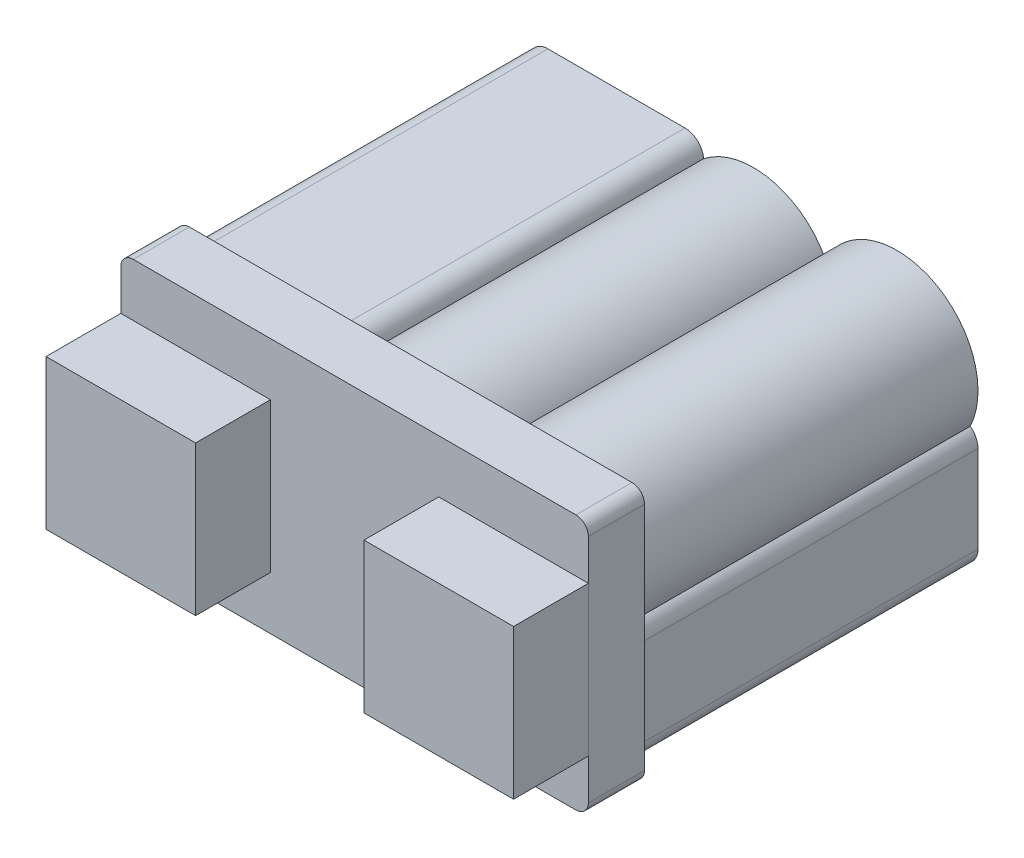
ISO-10303-21;
HEADER;
FILE_DESCRIPTION(('STEP AP214'),'2;1');
FILE_NAME('part.step','',(''),(''),'','','');
FILE_SCHEMA(('AUTOMOTIVE_DESIGN { 1 0 10303 214 1 1 1 1 }'));
ENDSEC;
DATA;
#1=APPLICATION_CONTEXT('core data for automotive mechanical design processes');
#2=APPLICATION_PROTOCOL_DEFINITION('international standard','automotive_design',2000,#1);
#3=PRODUCT_CONTEXT('',#1,'mechanical');
#4=PRODUCT('Part','Part','',(#3));
#5=PRODUCT_RELATED_PRODUCT_CATEGORY('part','',(#4));
#6=PRODUCT_DEFINITION_FORMATION('','',#4);
#7=PRODUCT_DEFINITION_CONTEXT('part definition',#1,'design');
#8=PRODUCT_DEFINITION('design','',#6,#7);
#9=PRODUCT_DEFINITION_SHAPE('','',#8);
#10=(LENGTH_UNIT() NAMED_UNIT(*) SI_UNIT(.MILLI.,.METRE.));
#11=(NAMED_UNIT(*) PLANE_ANGLE_UNIT() SI_UNIT($,.RADIAN.));
#12=(NAMED_UNIT(*) SI_UNIT($,.STERADIAN.) SOLID_ANGLE_UNIT());
#13=UNCERTAINTY_MEASURE_WITH_UNIT(LENGTH_MEASURE(1.E-05),#10,'distance_accuracy_value','');
#14=(GEOMETRIC_REPRESENTATION_CONTEXT(3) GLOBAL_UNCERTAINTY_ASSIGNED_CONTEXT((#13)) GLOBAL_UNIT_ASSIGNED_CONTEXT((#10,
#11,#12)) REPRESENTATION_CONTEXT('',''));
#15=CARTESIAN_POINT('',(0.,0.,0.));
#16=DIRECTION('',(0.,0.,1.));
#17=DIRECTION('',(1.,0.,0.));
#18=AXIS2_PLACEMENT_3D('',#15,#16,#17);
#19=CARTESIAN_POINT('',(-119.0625,38.1,241.3));
#20=DIRECTION('',(1.,0.,0.));
#21=DIRECTION('',(0.,0.,-1.));
#22=AXIS2_PLACEMENT_3D('',#19,#20,#21);
#23=PLANE('',#22);
#24=DIRECTION('',(0.,0.,1.));
#25=VECTOR('',#24,1.);
#26=CARTESIAN_POINT('',(-119.0625,-38.1,241.3));
#27=LINE('',#26,#25);
#28=CARTESIAN_POINT('',(-119.0625,-38.1,203.2));
#29=VERTEX_POINT('',#28);
#30=CARTESIAN_POINT('',(-119.0625,-38.1,241.3));
#31=VERTEX_POINT('',#30);
#32=EDGE_CURVE('E114',#29,#31,#27,.T.);
#33=ORIENTED_EDGE('',*,*,#32,.T.);
#34=DIRECTION('',(0.,-1.,0.));
#35=VECTOR('',#34,1.);
#36=CARTESIAN_POINT('',(-119.0625,38.1,241.3));
#37=LINE('',#36,#35);
#38=CARTESIAN_POINT('',(-119.0625,38.1,241.3));
#39=VERTEX_POINT('',#38);
#40=EDGE_CURVE('E12',#39,#31,#37,.T.);
#41=ORIENTED_EDGE('',*,*,#40,.F.);
#42=DIRECTION('',(0.,0.,1.));
#43=VECTOR('',#42,1.);
#44=CARTESIAN_POINT('',(-119.0625,38.1,241.3));
#45=LINE('',#44,#43);
#46=CARTESIAN_POINT('',(-119.0625,38.1,203.2));
#47=VERTEX_POINT('',#46);
#48=EDGE_CURVE('E99',#47,#39,#45,.T.);
#49=ORIENTED_EDGE('',*,*,#48,.F.);
#50=DIRECTION('',(0.,-1.,0.));
#51=VECTOR('',#50,1.);
#52=CARTESIAN_POINT('',(-119.0625,38.1,203.2));
#53=LINE('',#52,#51);
#54=EDGE_CURVE('E101',#47,#29,#53,.T.);
#55=ORIENTED_EDGE('',*,*,#54,.T.);
#56=EDGE_LOOP('',(#33,#41,#49,#55));
#57=FACE_BOUND('',#56,.T.);
#58=ADVANCED_FACE('F48',(#57),#23,.F.);
#59=CARTESIAN_POINT('',(-119.0625,38.1,241.3));
#60=DIRECTION('',(0.,0.,-1.));
#61=DIRECTION('',(-1.,0.,0.));
#62=AXIS2_PLACEMENT_3D('',#59,#60,#61);
#63=PLANE('',#62);
#64=DIRECTION('',(1.,0.,0.));
#65=VECTOR('',#64,1.);
#66=CARTESIAN_POINT('',(-119.0625,-38.1,241.3));
#67=LINE('',#66,#65);
#68=CARTESIAN_POINT('',(-42.8624999999998,-38.1,241.3));
#69=VERTEX_POINT('',#68);
#70=EDGE_CURVE('E104',#31,#69,#67,.T.);
#71=ORIENTED_EDGE('',*,*,#70,.T.);
#72=DIRECTION('',(0.,-1.,0.));
#73=VECTOR('',#72,1.);
#74=CARTESIAN_POINT('',(-42.8624999999998,38.1,241.3));
#75=LINE('',#74,#73);
#76=CARTESIAN_POINT('',(-42.8624999999998,38.1,241.3));
#77=VERTEX_POINT('',#76);
#78=EDGE_CURVE('E56',#77,#69,#75,.T.);
#79=ORIENTED_EDGE('',*,*,#78,.F.);
#80=DIRECTION('',(1.,0.,0.));
#81=VECTOR('',#80,1.);
#82=CARTESIAN_POINT('',(-119.0625,38.1,241.3));
#83=LINE('',#82,#81);
#84=EDGE_CURVE('E94',#39,#77,#83,.T.);
#85=ORIENTED_EDGE('',*,*,#84,.F.);
#86=ORIENTED_EDGE('',*,*,#40,.T.);
#87=EDGE_LOOP('',(#71,#79,#85,#86));
#88=FACE_BOUND('',#87,.T.);
#89=ADVANCED_FACE('F103',(#88),#63,.F.);
#90=CARTESIAN_POINT('',(-42.8624999999998,38.1,241.3));
#91=DIRECTION('',(-1.,0.,0.));
#92=DIRECTION('',(0.,0.,1.));
#93=AXIS2_PLACEMENT_3D('',#90,#91,#92);
#94=PLANE('',#93);
#95=DIRECTION('',(0.,0.,-1.));
#96=VECTOR('',#95,1.);
#97=CARTESIAN_POINT('',(-42.8624999999998,-38.1,241.3));
#98=LINE('',#97,#96);
#99=CARTESIAN_POINT('',(-42.8624999999999,-38.1,203.2));
#100=VERTEX_POINT('',#99);
#101=EDGE_CURVE('E81',#69,#100,#98,.T.);
#102=ORIENTED_EDGE('',*,*,#101,.T.);
#103=DIRECTION('',(0.,-1.,0.));
#104=VECTOR('',#103,1.);
#105=CARTESIAN_POINT('',(-42.8624999999999,38.1,203.2));
#106=LINE('',#105,#104);
#107=CARTESIAN_POINT('',(-42.8624999999999,38.1,203.2));
#108=VERTEX_POINT('',#107);
#109=EDGE_CURVE('E105',#108,#100,#106,.T.);
#110=ORIENTED_EDGE('',*,*,#109,.F.);
#111=DIRECTION('',(0.,0.,-1.));
#112=VECTOR('',#111,1.);
#113=CARTESIAN_POINT('',(-42.8624999999998,38.1,241.3));
#114=LINE('',#113,#112);
#115=EDGE_CURVE('E97',#77,#108,#114,.T.);
#116=ORIENTED_EDGE('',*,*,#115,.F.);
#117=ORIENTED_EDGE('',*,*,#78,.T.);
#118=EDGE_LOOP('',(#102,#110,#116,#117));
#119=FACE_BOUND('',#118,.T.);
#120=ADVANCED_FACE('F106',(#119),#94,.F.);
#121=CARTESIAN_POINT('',(-119.0625,38.1,203.2));
#122=DIRECTION('',(0.,0.,1.));
#123=DIRECTION('',(1.,0.,0.));
#124=AXIS2_PLACEMENT_3D('',#121,#122,#123);
#125=PLANE('',#124);
#126=DIRECTION('',(-1.,0.,0.));
#127=VECTOR('',#126,1.);
#128=CARTESIAN_POINT('',(-119.0625,-38.1,203.2));
#129=LINE('',#128,#127);
#130=EDGE_CURVE('E87',#100,#29,#129,.T.);
#131=ORIENTED_EDGE('',*,*,#130,.T.);
#132=ORIENTED_EDGE('',*,*,#54,.F.);
#133=DIRECTION('',(-1.,0.,0.));
#134=VECTOR('',#133,1.);
#135=CARTESIAN_POINT('',(-119.0625,38.1,203.2));
#136=LINE('',#135,#134);
#137=EDGE_CURVE('E64',#108,#47,#136,.T.);
#138=ORIENTED_EDGE('',*,*,#137,.F.);
#139=ORIENTED_EDGE('',*,*,#109,.T.);
#140=EDGE_LOOP('',(#131,#132,#138,#139));
#141=FACE_BOUND('',#140,.T.);
#142=ADVANCED_FACE('F118',(#141),#125,.F.);
#143=CARTESIAN_POINT('',(-119.0625,38.1,203.2));
#144=DIRECTION('',(0.,-1.,0.));
#145=DIRECTION('',(0.,0.,-1.));
#146=AXIS2_PLACEMENT_3D('',#143,#144,#145);
#147=PLANE('',#146);
#148=ORIENTED_EDGE('',*,*,#48,.T.);
#149=ORIENTED_EDGE('',*,*,#84,.T.);
#150=ORIENTED_EDGE('',*,*,#115,.T.);
#151=ORIENTED_EDGE('',*,*,#137,.T.);
#152=EDGE_LOOP('',(#148,#149,#150,#151));
#153=FACE_BOUND('',#152,.T.);
#154=ADVANCED_FACE('F95',(#153),#147,.F.);
#155=CARTESIAN_POINT('',(-119.0625,-38.1,203.2));
#156=DIRECTION('',(0.,-1.,0.));
#157=DIRECTION('',(0.,0.,-1.));
#158=AXIS2_PLACEMENT_3D('',#155,#156,#157);
#159=PLANE('',#158);
#160=ORIENTED_EDGE('',*,*,#32,.F.);
#161=ORIENTED_EDGE('',*,*,#130,.F.);
#162=ORIENTED_EDGE('',*,*,#101,.F.);
#163=ORIENTED_EDGE('',*,*,#70,.F.);
#164=EDGE_LOOP('',(#160,#161,#162,#163));
#165=FACE_BOUND('',#164,.T.);
#166=ADVANCED_FACE('F121',(#165),#159,.T.);
#167=CLOSED_SHELL('',(#58,#89,#120,#142,#154,#166));
#168=MANIFOLD_SOLID_BREP('B2',#167);
#169=CARTESIAN_POINT('',(119.0625,38.1,241.3));
#170=DIRECTION('',(-1.,0.,0.));
#171=DIRECTION('',(0.,0.,1.));
#172=AXIS2_PLACEMENT_3D('',#169,#170,#171);
#173=PLANE('',#172);
#174=DIRECTION('',(0.,0.,-1.));
#175=VECTOR('',#174,1.);
#176=CARTESIAN_POINT('',(119.0625,-38.1,241.3));
#177=LINE('',#176,#175);
#178=CARTESIAN_POINT('',(119.0625,-38.1,241.3));
#179=VERTEX_POINT('',#178);
#180=CARTESIAN_POINT('',(119.0625,-38.1,203.2));
#181=VERTEX_POINT('',#180);
#182=EDGE_CURVE('E246',#179,#181,#177,.T.);
#183=ORIENTED_EDGE('',*,*,#182,.T.);
#184=DIRECTION('',(0.,-1.,0.));
#185=VECTOR('',#184,1.);
#186=CARTESIAN_POINT('',(119.0625,38.1,203.2));
#187=LINE('',#186,#185);
#188=CARTESIAN_POINT('',(119.0625,38.1,203.2));
#189=VERTEX_POINT('',#188);
#190=EDGE_CURVE('E46',#189,#181,#187,.T.);
#191=ORIENTED_EDGE('',*,*,#190,.F.);
#192=DIRECTION('',(0.,0.,-1.));
#193=VECTOR('',#192,1.);
#194=CARTESIAN_POINT('',(119.0625,38.1,241.3));
#195=LINE('',#194,#193);
#196=CARTESIAN_POINT('',(119.0625,38.1,241.3));
#197=VERTEX_POINT('',#196);
#198=EDGE_CURVE('E242',#197,#189,#195,.T.);
#199=ORIENTED_EDGE('',*,*,#198,.F.);
#200=DIRECTION('',(0.,-1.,0.));
#201=VECTOR('',#200,1.);
#202=CARTESIAN_POINT('',(119.0625,38.1,241.3));
#203=LINE('',#202,#201);
#204=EDGE_CURVE('E184',#197,#179,#203,.T.);
#205=ORIENTED_EDGE('',*,*,#204,.T.);
#206=EDGE_LOOP('',(#183,#191,#199,#205));
#207=FACE_BOUND('',#206,.T.);
#208=ADVANCED_FACE('F181',(#207),#173,.F.);
#209=CARTESIAN_POINT('',(119.0625,38.1,203.2));
#210=DIRECTION('',(0.,0.,1.));
#211=DIRECTION('',(1.,0.,0.));
#212=AXIS2_PLACEMENT_3D('',#209,#210,#211);
#213=PLANE('',#212);
#214=DIRECTION('',(-1.,0.,0.));
#215=VECTOR('',#214,1.);
#216=CARTESIAN_POINT('',(119.0625,-38.1,203.2));
#217=LINE('',#216,#215);
#218=CARTESIAN_POINT('',(42.8625,-38.1,203.2));
#219=VERTEX_POINT('',#218);
#220=EDGE_CURVE('E212',#181,#219,#217,.T.);
#221=ORIENTED_EDGE('',*,*,#220,.T.);
#222=DIRECTION('',(0.,-1.,0.));
#223=VECTOR('',#222,1.);
#224=CARTESIAN_POINT('',(42.8625,38.1,203.2));
#225=LINE('',#224,#223);
#226=CARTESIAN_POINT('',(42.8625,38.1,203.2));
#227=VERTEX_POINT('',#226);
#228=EDGE_CURVE('E190',#227,#219,#225,.T.);
#229=ORIENTED_EDGE('',*,*,#228,.F.);
#230=DIRECTION('',(-1.,0.,0.));
#231=VECTOR('',#230,1.);
#232=CARTESIAN_POINT('',(119.0625,38.1,203.2));
#233=LINE('',#232,#231);
#234=EDGE_CURVE('E198',#189,#227,#233,.T.);
#235=ORIENTED_EDGE('',*,*,#234,.F.);
#236=ORIENTED_EDGE('',*,*,#190,.T.);
#237=EDGE_LOOP('',(#221,#229,#235,#236));
#238=FACE_BOUND('',#237,.T.);
#239=ADVANCED_FACE('F255',(#238),#213,.F.);
#240=CARTESIAN_POINT('',(42.8625,38.1,241.3));
#241=DIRECTION('',(1.,0.,0.));
#242=DIRECTION('',(0.,0.,-1.));
#243=AXIS2_PLACEMENT_3D('',#240,#241,#242);
#244=PLANE('',#243);
#245=DIRECTION('',(0.,0.,1.));
#246=VECTOR('',#245,1.);
#247=CARTESIAN_POINT('',(42.8625,-38.1,241.3));
#248=LINE('',#247,#246);
#249=CARTESIAN_POINT('',(42.8625,-38.1,241.3));
#250=VERTEX_POINT('',#249);
#251=EDGE_CURVE('E234',#219,#250,#248,.T.);
#252=ORIENTED_EDGE('',*,*,#251,.T.);
#253=DIRECTION('',(0.,-1.,0.));
#254=VECTOR('',#253,1.);
#255=CARTESIAN_POINT('',(42.8625,38.1,241.3));
#256=LINE('',#255,#254);
#257=CARTESIAN_POINT('',(42.8625,38.1,241.3));
#258=VERTEX_POINT('',#257);
#259=EDGE_CURVE('E232',#258,#250,#256,.T.);
#260=ORIENTED_EDGE('',*,*,#259,.F.);
#261=DIRECTION('',(0.,0.,1.));
#262=VECTOR('',#261,1.);
#263=CARTESIAN_POINT('',(42.8625,38.1,241.3));
#264=LINE('',#263,#262);
#265=EDGE_CURVE('E226',#227,#258,#264,.T.);
#266=ORIENTED_EDGE('',*,*,#265,.F.);
#267=ORIENTED_EDGE('',*,*,#228,.T.);
#268=EDGE_LOOP('',(#252,#260,#266,#267));
#269=FACE_BOUND('',#268,.T.);
#270=ADVANCED_FACE('F233',(#269),#244,.F.);
#271=CARTESIAN_POINT('',(119.0625,38.1,241.3));
#272=DIRECTION('',(0.,0.,-1.));
#273=DIRECTION('',(-1.,0.,0.));
#274=AXIS2_PLACEMENT_3D('',#271,#272,#273);
#275=PLANE('',#274);
#276=DIRECTION('',(1.,0.,0.));
#277=VECTOR('',#276,1.);
#278=CARTESIAN_POINT('',(119.0625,-38.1,241.3));
#279=LINE('',#278,#277);
#280=EDGE_CURVE('E249',#250,#179,#279,.T.);
#281=ORIENTED_EDGE('',*,*,#280,.T.);
#282=ORIENTED_EDGE('',*,*,#204,.F.);
#283=DIRECTION('',(1.,0.,0.));
#284=VECTOR('',#283,1.);
#285=CARTESIAN_POINT('',(119.0625,38.1,241.3));
#286=LINE('',#285,#284);
#287=EDGE_CURVE('E223',#258,#197,#286,.T.);
#288=ORIENTED_EDGE('',*,*,#287,.F.);
#289=ORIENTED_EDGE('',*,*,#259,.T.);
#290=EDGE_LOOP('',(#281,#282,#288,#289));
#291=FACE_BOUND('',#290,.T.);
#292=ADVANCED_FACE('F237',(#291),#275,.F.);
#293=CARTESIAN_POINT('',(119.0625,38.1,203.2));
#294=DIRECTION('',(0.,1.,0.));
#295=DIRECTION('',(0.,0.,1.));
#296=AXIS2_PLACEMENT_3D('',#293,#294,#295);
#297=PLANE('',#296);
#298=ORIENTED_EDGE('',*,*,#198,.T.);
#299=ORIENTED_EDGE('',*,*,#234,.T.);
#300=ORIENTED_EDGE('',*,*,#265,.T.);
#301=ORIENTED_EDGE('',*,*,#287,.T.);
#302=EDGE_LOOP('',(#298,#299,#300,#301));
#303=FACE_BOUND('',#302,.T.);
#304=ADVANCED_FACE('F228',(#303),#297,.T.);
#305=CARTESIAN_POINT('',(119.0625,-38.1,203.2));
#306=DIRECTION('',(0.,1.,0.));
#307=DIRECTION('',(0.,0.,1.));
#308=AXIS2_PLACEMENT_3D('',#305,#306,#307);
#309=PLANE('',#308);
#310=ORIENTED_EDGE('',*,*,#182,.F.);
#311=ORIENTED_EDGE('',*,*,#280,.F.);
#312=ORIENTED_EDGE('',*,*,#251,.F.);
#313=ORIENTED_EDGE('',*,*,#220,.F.);
#314=EDGE_LOOP('',(#310,#311,#312,#313));
#315=FACE_BOUND('',#314,.T.);
#316=ADVANCED_FACE('F252',(#315),#309,.F.);
#317=CLOSED_SHELL('',(#208,#239,#270,#292,#304,#316));
#318=MANIFOLD_SOLID_BREP('B6',#317);
#319=CARTESIAN_POINT('',(119.0625,-65.0875,203.2));
#320=DIRECTION('',(-1.,0.,0.));
#321=DIRECTION('',(0.,0.,1.));
#322=AXIS2_PLACEMENT_3D('',#319,#320,#321);
#323=PLANE('',#322);
#324=DIRECTION('',(0.,1.,0.));
#325=VECTOR('',#324,1.);
#326=CARTESIAN_POINT('',(119.0625,-65.0875,203.2));
#327=LINE('',#326,#325);
#328=CARTESIAN_POINT('',(119.0625,-58.7375,203.2));
#329=VERTEX_POINT('',#328);
#330=CARTESIAN_POINT('',(119.0625,58.7375,203.2));
#331=VERTEX_POINT('',#330);
#332=EDGE_CURVE('E561',#329,#331,#327,.T.);
#333=ORIENTED_EDGE('',*,*,#332,.F.);
#334=DIRECTION('',(0.,0.,-1.));
#335=VECTOR('',#334,1.);
#336=CARTESIAN_POINT('',(119.0625,-58.7375,203.2));
#337=LINE('',#336,#335);
#338=CARTESIAN_POINT('',(119.0625,-58.7375,174.625));
#339=VERTEX_POINT('',#338);
#340=EDGE_CURVE('E179',#329,#339,#337,.T.);
#341=ORIENTED_EDGE('',*,*,#340,.T.);
#342=DIRECTION('',(0.,-1.,0.));
#343=VECTOR('',#342,1.);
#344=CARTESIAN_POINT('',(119.0625,0.,174.625));
#345=LINE('',#344,#343);
#346=CARTESIAN_POINT('',(119.0625,58.7375,174.625));
#347=VERTEX_POINT('',#346);
#348=EDGE_CURVE('E513',#347,#339,#345,.T.);
#349=ORIENTED_EDGE('',*,*,#348,.F.);
#350=DIRECTION('',(0.,0.,-1.));
#351=VECTOR('',#350,1.);
#352=CARTESIAN_POINT('',(119.0625,58.7375,203.2));
#353=LINE('',#352,#351);
#354=EDGE_CURVE('E312',#347,#331,#353,.F.);
#355=ORIENTED_EDGE('',*,*,#354,.T.);
#356=EDGE_LOOP('',(#333,#341,#349,#355));
#357=FACE_BOUND('',#356,.T.);
#358=ADVANCED_FACE('F304',(#357),#323,.F.);
#359=CARTESIAN_POINT('',(-119.0625,65.0875,203.2));
#360=DIRECTION('',(0.,-1.,0.));
#361=DIRECTION('',(0.,0.,-1.));
#362=AXIS2_PLACEMENT_3D('',#359,#360,#361);
#363=PLANE('',#362);
#364=DIRECTION('',(1.,0.,0.));
#365=VECTOR('',#364,1.);
#366=CARTESIAN_POINT('',(-211.228306266812,65.0875,174.625));
#367=LINE('',#366,#365);
#368=CARTESIAN_POINT('',(-112.7125,65.0875,174.625));
#369=VERTEX_POINT('',#368);
#370=CARTESIAN_POINT('',(112.7125,65.0875,174.625));
#371=VERTEX_POINT('',#370);
#372=EDGE_CURVE('E510',#369,#371,#367,.T.);
#373=ORIENTED_EDGE('',*,*,#372,.F.);
#374=DIRECTION('',(0.,0.,-1.));
#375=VECTOR('',#374,1.);
#376=CARTESIAN_POINT('',(-112.7125,65.0875,203.2));
#377=LINE('',#376,#375);
#378=CARTESIAN_POINT('',(-112.7125,65.0875,203.2));
#379=VERTEX_POINT('',#378);
#380=EDGE_CURVE('E319',#369,#379,#377,.F.);
#381=ORIENTED_EDGE('',*,*,#380,.T.);
#382=DIRECTION('',(-1.,0.,0.));
#383=VECTOR('',#382,1.);
#384=CARTESIAN_POINT('',(-119.0625,65.0875,203.2));
#385=LINE('',#384,#383);
#386=CARTESIAN_POINT('',(112.7125,65.0875,203.2));
#387=VERTEX_POINT('',#386);
#388=EDGE_CURVE('E586',#387,#379,#385,.T.);
#389=ORIENTED_EDGE('',*,*,#388,.F.);
#390=DIRECTION('',(0.,0.,-1.));
#391=VECTOR('',#390,1.);
#392=CARTESIAN_POINT('',(112.7125,65.0875,203.2));
#393=LINE('',#392,#391);
#394=EDGE_CURVE('E619',#387,#371,#393,.T.);
#395=ORIENTED_EDGE('',*,*,#394,.T.);
#396=EDGE_LOOP('',(#373,#381,#389,#395));
#397=FACE_BOUND('',#396,.T.);
#398=ADVANCED_FACE('F631',(#397),#363,.F.);
#399=CARTESIAN_POINT('',(-119.0625,-65.0875,203.2));
#400=DIRECTION('',(1.,0.,0.));
#401=DIRECTION('',(0.,0.,-1.));
#402=AXIS2_PLACEMENT_3D('',#399,#400,#401);
#403=PLANE('',#402);
#404=DIRECTION('',(0.,1.,0.));
#405=VECTOR('',#404,1.);
#406=CARTESIAN_POINT('',(-119.0625,0.,174.625));
#407=LINE('',#406,#405);
#408=CARTESIAN_POINT('',(-119.0625,-58.7375,174.625));
#409=VERTEX_POINT('',#408);
#410=CARTESIAN_POINT('',(-119.0625,58.7375,174.625));
#411=VERTEX_POINT('',#410);
#412=EDGE_CURVE('E466',#409,#411,#407,.T.);
#413=ORIENTED_EDGE('',*,*,#412,.F.);
#414=DIRECTION('',(0.,0.,-1.));
#415=VECTOR('',#414,1.);
#416=CARTESIAN_POINT('',(-119.0625,-58.7375,203.2));
#417=LINE('',#416,#415);
#418=CARTESIAN_POINT('',(-119.0625,-58.7375,203.2));
#419=VERTEX_POINT('',#418);
#420=EDGE_CURVE('E610',#409,#419,#417,.F.);
#421=ORIENTED_EDGE('',*,*,#420,.T.);
#422=DIRECTION('',(0.,-1.,0.));
#423=VECTOR('',#422,1.);
#424=CARTESIAN_POINT('',(-119.0625,-65.0875,203.2));
#425=LINE('',#424,#423);
#426=CARTESIAN_POINT('',(-119.0625,58.7375,203.2));
#427=VERTEX_POINT('',#426);
#428=EDGE_CURVE('E588',#427,#419,#425,.T.);
#429=ORIENTED_EDGE('',*,*,#428,.F.);
#430=DIRECTION('',(0.,0.,-1.));
#431=VECTOR('',#430,1.);
#432=CARTESIAN_POINT('',(-119.0625,58.7375,203.2));
#433=LINE('',#432,#431);
#434=EDGE_CURVE('E607',#427,#411,#433,.T.);
#435=ORIENTED_EDGE('',*,*,#434,.T.);
#436=EDGE_LOOP('',(#413,#421,#429,#435));
#437=FACE_BOUND('',#436,.T.);
#438=ADVANCED_FACE('F639',(#437),#403,.F.);
#439=CARTESIAN_POINT('',(-119.0625,-65.0875,203.2));
#440=DIRECTION('',(0.,1.,0.));
#441=DIRECTION('',(0.,0.,1.));
#442=AXIS2_PLACEMENT_3D('',#439,#440,#441);
#443=PLANE('',#442);
#444=DIRECTION('',(1.,0.,0.));
#445=VECTOR('',#444,1.);
#446=CARTESIAN_POINT('',(-119.0625,-65.0875,203.2));
#447=LINE('',#446,#445);
#448=CARTESIAN_POINT('',(-112.7125,-65.0875,203.2));
#449=VERTEX_POINT('',#448);
#450=CARTESIAN_POINT('',(112.7125,-65.0875,203.2));
#451=VERTEX_POINT('',#450);
#452=EDGE_CURVE('E591',#449,#451,#447,.T.);
#453=ORIENTED_EDGE('',*,*,#452,.F.);
#454=DIRECTION('',(0.,0.,-1.));
#455=VECTOR('',#454,1.);
#456=CARTESIAN_POINT('',(-112.7125,-65.0875,203.2));
#457=LINE('',#456,#455);
#458=CARTESIAN_POINT('',(-112.7125,-65.0875,174.625));
#459=VERTEX_POINT('',#458);
#460=EDGE_CURVE('E596',#449,#459,#457,.T.);
#461=ORIENTED_EDGE('',*,*,#460,.T.);
#462=DIRECTION('',(-1.,0.,0.));
#463=VECTOR('',#462,1.);
#464=CARTESIAN_POINT('',(-211.228306266812,-65.0875,174.625));
#465=LINE('',#464,#463);
#466=CARTESIAN_POINT('',(112.7125,-65.0875,174.625));
#467=VERTEX_POINT('',#466);
#468=EDGE_CURVE('E516',#467,#459,#465,.T.);
#469=ORIENTED_EDGE('',*,*,#468,.F.);
#470=DIRECTION('',(0.,0.,-1.));
#471=VECTOR('',#470,1.);
#472=CARTESIAN_POINT('',(112.7125,-65.0875,203.2));
#473=LINE('',#472,#471);
#474=EDGE_CURVE('E594',#467,#451,#473,.F.);
#475=ORIENTED_EDGE('',*,*,#474,.T.);
#476=EDGE_LOOP('',(#453,#461,#469,#475));
#477=FACE_BOUND('',#476,.T.);
#478=ADVANCED_FACE('F648',(#477),#443,.F.);
#479=CARTESIAN_POINT('',(119.0625,65.0875,203.2));
#480=DIRECTION('',(0.,0.,-1.));
#481=DIRECTION('',(-1.,0.,0.));
#482=AXIS2_PLACEMENT_3D('',#479,#480,#481);
#483=PLANE('',#482);
#484=ORIENTED_EDGE('',*,*,#428,.T.);
#485=CARTESIAN_POINT('',(-112.7125,-58.7375,203.2));
#486=DIRECTION('',(0.,0.,-1.));
#487=DIRECTION('',(-1.,0.,0.));
#488=AXIS2_PLACEMENT_3D('',#485,#486,#487);
#489=CIRCLE('',#488,6.35);
#490=EDGE_CURVE('E617',#419,#449,#489,.F.);
#491=ORIENTED_EDGE('',*,*,#490,.T.);
#492=ORIENTED_EDGE('',*,*,#452,.T.);
#493=CARTESIAN_POINT('',(112.7125,-58.7375,203.2));
#494=DIRECTION('',(0.,0.,-1.));
#495=DIRECTION('',(-1.,0.,0.));
#496=AXIS2_PLACEMENT_3D('',#493,#494,#495);
#497=CIRCLE('',#496,6.35);
#498=EDGE_CURVE('E613',#451,#329,#497,.F.);
#499=ORIENTED_EDGE('',*,*,#498,.T.);
#500=ORIENTED_EDGE('',*,*,#332,.T.);
#501=CARTESIAN_POINT('',(112.7125,58.7375,203.2));
#502=DIRECTION('',(0.,0.,-1.));
#503=DIRECTION('',(-1.,0.,0.));
#504=AXIS2_PLACEMENT_3D('',#501,#502,#503);
#505=CIRCLE('',#504,6.35);
#506=EDGE_CURVE('E326',#331,#387,#505,.F.);
#507=ORIENTED_EDGE('',*,*,#506,.T.);
#508=ORIENTED_EDGE('',*,*,#388,.T.);
#509=CARTESIAN_POINT('',(-112.7125,58.7375,203.2));
#510=DIRECTION('',(0.,0.,-1.));
#511=DIRECTION('',(-1.,0.,0.));
#512=AXIS2_PLACEMENT_3D('',#509,#510,#511);
#513=CIRCLE('',#512,6.35);
#514=EDGE_CURVE('E615',#379,#427,#513,.F.);
#515=ORIENTED_EDGE('',*,*,#514,.T.);
#516=EDGE_LOOP('',(#484,#491,#492,#499,#500,#507,#508,#515));
#517=FACE_BOUND('',#516,.T.);
#518=ADVANCED_FACE('F628',(#517),#483,.F.);
#519=CARTESIAN_POINT('',(104.775,-50.8,174.625));
#520=DIRECTION('',(0.,0.,-1.));
#521=DIRECTION('',(-1.,0.,0.));
#522=AXIS2_PLACEMENT_3D('',#519,#520,#521);
#523=CYLINDRICAL_SURFACE('',#522,9.52499999999999);
#524=CARTESIAN_POINT('',(104.775,-50.8,0.));
#525=DIRECTION('',(0.,0.,-1.));
#526=DIRECTION('',(-1.,0.,0.));
#527=AXIS2_PLACEMENT_3D('',#524,#525,#526);
#528=CIRCLE('',#527,9.52499999999999);
#529=CARTESIAN_POINT('',(114.3,-50.8,0.));
#530=VERTEX_POINT('',#529);
#531=CARTESIAN_POINT('',(104.775,-60.325,0.));
#532=VERTEX_POINT('',#531);
#533=EDGE_CURVE('E460',#530,#532,#528,.T.);
#534=ORIENTED_EDGE('',*,*,#533,.F.);
#535=DIRECTION('',(0.,0.,-1.));
#536=VECTOR('',#535,1.);
#537=CARTESIAN_POINT('',(114.3,-50.8,174.625));
#538=LINE('',#537,#536);
#539=CARTESIAN_POINT('',(114.3,-50.8,174.625));
#540=VERTEX_POINT('',#539);
#541=EDGE_CURVE('E454',#540,#530,#538,.T.);
#542=ORIENTED_EDGE('',*,*,#541,.F.);
#543=CARTESIAN_POINT('',(104.775,-50.8,174.625));
#544=DIRECTION('',(0.,0.,-1.));
#545=DIRECTION('',(-1.,0.,0.));
#546=AXIS2_PLACEMENT_3D('',#543,#544,#545);
#547=CIRCLE('',#546,9.52499999999999);
#548=CARTESIAN_POINT('',(104.775,-60.325,174.625));
#549=VERTEX_POINT('',#548);
#550=EDGE_CURVE('E457',#540,#549,#547,.T.);
#551=ORIENTED_EDGE('',*,*,#550,.T.);
#552=DIRECTION('',(0.,0.,-1.));
#553=VECTOR('',#552,1.);
#554=CARTESIAN_POINT('',(104.775,-60.325,174.625));
#555=LINE('',#554,#553);
#556=EDGE_CURVE('E559',#549,#532,#555,.T.);
#557=ORIENTED_EDGE('',*,*,#556,.T.);
#558=EDGE_LOOP('',(#534,#542,#551,#557));
#559=FACE_BOUND('',#558,.T.);
#560=ADVANCED_FACE('F456',(#559),#523,.T.);
#561=CARTESIAN_POINT('',(-211.228306266812,-60.325,174.625));
#562=DIRECTION('',(0.,1.,0.));
#563=DIRECTION('',(0.,0.,1.));
#564=AXIS2_PLACEMENT_3D('',#561,#562,#563);
#565=PLANE('',#564);
#566=DIRECTION('',(1.,0.,0.));
#567=VECTOR('',#566,1.);
#568=CARTESIAN_POINT('',(-211.228306266812,-60.325,0.));
#569=LINE('',#568,#567);
#570=CARTESIAN_POINT('',(34.925,-60.325,0.));
#571=VERTEX_POINT('',#570);
#572=EDGE_CURVE('E478',#571,#532,#569,.T.);
#573=ORIENTED_EDGE('',*,*,#572,.T.);
#574=ORIENTED_EDGE('',*,*,#556,.F.);
#575=DIRECTION('',(1.,0.,0.));
#576=VECTOR('',#575,1.);
#577=CARTESIAN_POINT('',(-211.228306266812,-60.325,174.625));
#578=LINE('',#577,#576);
#579=CARTESIAN_POINT('',(34.925,-60.325,174.625));
#580=VERTEX_POINT('',#579);
#581=EDGE_CURVE('E477',#580,#549,#578,.T.);
#582=ORIENTED_EDGE('',*,*,#581,.F.);
#583=DIRECTION('',(0.,0.,-1.));
#584=VECTOR('',#583,1.);
#585=CARTESIAN_POINT('',(34.925,-60.325,174.625));
#586=LINE('',#585,#584);
#587=EDGE_CURVE('E562',#580,#571,#586,.T.);
#588=ORIENTED_EDGE('',*,*,#587,.T.);
#589=EDGE_LOOP('',(#573,#574,#582,#588));
#590=FACE_BOUND('',#589,.T.);
#591=ADVANCED_FACE('F702',(#590),#565,.F.);
#592=CARTESIAN_POINT('',(34.925,-50.8,174.625));
#593=DIRECTION('',(0.,0.,-1.));
#594=DIRECTION('',(-1.,0.,0.));
#595=AXIS2_PLACEMENT_3D('',#592,#593,#594);
#596=CYLINDRICAL_SURFACE('',#595,9.525);
#597=CARTESIAN_POINT('',(34.925,-50.8,0.));
#598=DIRECTION('',(0.,0.,-1.));
#599=DIRECTION('',(-1.,0.,0.));
#600=AXIS2_PLACEMENT_3D('',#597,#598,#599);
#601=CIRCLE('',#600,9.525);
#602=CARTESIAN_POINT('',(25.4303939722906,-51.5603166304803,0.));
#603=VERTEX_POINT('',#602);
#604=EDGE_CURVE('E554',#603,#571,#601,.F.);
#605=ORIENTED_EDGE('',*,*,#604,.T.);
#606=ORIENTED_EDGE('',*,*,#587,.F.);
#607=CARTESIAN_POINT('',(34.925,-50.8,174.625));
#608=DIRECTION('',(0.,0.,-1.));
#609=DIRECTION('',(-1.,0.,0.));
#610=AXIS2_PLACEMENT_3D('',#607,#608,#609);
#611=CIRCLE('',#610,9.525);
#612=CARTESIAN_POINT('',(25.4303939722906,-51.5603166304803,174.625));
#613=VERTEX_POINT('',#612);
#614=EDGE_CURVE('E507',#613,#580,#611,.F.);
#615=ORIENTED_EDGE('',*,*,#614,.F.);
#616=DIRECTION('',(0.,0.,-1.));
#617=VECTOR('',#616,1.);
#618=CARTESIAN_POINT('',(25.4303939722906,-51.5603166304803,174.625));
#619=LINE('',#618,#617);
#620=EDGE_CURVE('E564',#613,#603,#619,.T.);
#621=ORIENTED_EDGE('',*,*,#620,.T.);
#622=EDGE_LOOP('',(#605,#606,#615,#621));
#623=FACE_BOUND('',#622,.T.);
#624=ADVANCED_FACE('F708',(#623),#596,.T.);
#625=CARTESIAN_POINT('',(0.,-19.05,174.625));
#626=DIRECTION('',(0.,0.,-1.));
#627=DIRECTION('',(-1.,0.,0.));
#628=AXIS2_PLACEMENT_3D('',#625,#626,#627);
#629=CYLINDRICAL_SURFACE('',#628,41.275);
#630=CARTESIAN_POINT('',(0.,-19.05,0.));
#631=DIRECTION('',(0.,0.,-1.));
#632=DIRECTION('',(-1.,0.,0.));
#633=AXIS2_PLACEMENT_3D('',#630,#631,#632);
#634=CIRCLE('',#633,41.275);
#635=CARTESIAN_POINT('',(-36.5125,-38.2974145991091,0.));
#636=VERTEX_POINT('',#635);
#637=EDGE_CURVE('E551',#603,#636,#634,.T.);
#638=ORIENTED_EDGE('',*,*,#637,.F.);
#639=ORIENTED_EDGE('',*,*,#620,.F.);
#640=CARTESIAN_POINT('',(0.,-19.05,174.625));
#641=DIRECTION('',(0.,0.,-1.));
#642=DIRECTION('',(-1.,0.,0.));
#643=AXIS2_PLACEMENT_3D('',#640,#641,#642);
#644=CIRCLE('',#643,41.275);
#645=CARTESIAN_POINT('',(-36.5125,-38.2974145991091,174.625));
#646=VERTEX_POINT('',#645);
#647=EDGE_CURVE('E505',#613,#646,#644,.T.);
#648=ORIENTED_EDGE('',*,*,#647,.T.);
#649=DIRECTION('',(0.,0.,-1.));
#650=VECTOR('',#649,1.);
#651=CARTESIAN_POINT('',(-36.5125,-38.2974145991091,174.625));
#652=LINE('',#651,#650);
#653=EDGE_CURVE('E566',#646,#636,#652,.T.);
#654=ORIENTED_EDGE('',*,*,#653,.T.);
#655=EDGE_LOOP('',(#638,#639,#648,#654));
#656=FACE_BOUND('',#655,.T.);
#657=ADVANCED_FACE('F716',(#656),#629,.T.);
#658=CARTESIAN_POINT('',(-73.025,-19.05,174.625));
#659=DIRECTION('',(0.,0.,-1.));
#660=DIRECTION('',(-1.,0.,0.));
#661=AXIS2_PLACEMENT_3D('',#658,#659,#660);
#662=CYLINDRICAL_SURFACE('',#661,41.275);
#663=CARTESIAN_POINT('',(-73.025,-19.05,0.));
#664=DIRECTION('',(0.,0.,-1.));
#665=DIRECTION('',(-1.,0.,0.));
#666=AXIS2_PLACEMENT_3D('',#663,#664,#665);
#667=CIRCLE('',#666,41.275);
#668=CARTESIAN_POINT('',(-110.329957106934,-1.38744638366728,0.));
#669=VERTEX_POINT('',#668);
#670=EDGE_CURVE('E548',#636,#669,#667,.T.);
#671=ORIENTED_EDGE('',*,*,#670,.F.);
#672=ORIENTED_EDGE('',*,*,#653,.F.);
#673=CARTESIAN_POINT('',(-73.025,-19.05,174.625));
#674=DIRECTION('',(0.,0.,-1.));
#675=DIRECTION('',(-1.,0.,0.));
#676=AXIS2_PLACEMENT_3D('',#673,#674,#675);
#677=CIRCLE('',#676,41.275);
#678=CARTESIAN_POINT('',(-110.329957106934,-1.38744638366728,174.625));
#679=VERTEX_POINT('',#678);
#680=EDGE_CURVE('E503',#646,#679,#677,.T.);
#681=ORIENTED_EDGE('',*,*,#680,.T.);
#682=DIRECTION('',(0.,0.,-1.));
#683=VECTOR('',#682,1.);
#684=CARTESIAN_POINT('',(-110.329957106934,-1.38744638366728,174.625));
#685=LINE('',#684,#683);
#686=EDGE_CURVE('E568',#679,#669,#685,.T.);
#687=ORIENTED_EDGE('',*,*,#686,.T.);
#688=EDGE_LOOP('',(#671,#672,#681,#687));
#689=FACE_BOUND('',#688,.T.);
#690=ADVANCED_FACE('F724',(#689),#662,.T.);
#691=CARTESIAN_POINT('',(-104.775,6.34999999999999,174.625));
#692=DIRECTION('',(0.,0.,-1.));
#693=DIRECTION('',(-1.,0.,0.));
#694=AXIS2_PLACEMENT_3D('',#691,#692,#693);
#695=CYLINDRICAL_SURFACE('',#694,9.525);
#696=CARTESIAN_POINT('',(-104.775,6.34999999999999,0.));
#697=DIRECTION('',(0.,0.,-1.));
#698=DIRECTION('',(-1.,0.,0.));
#699=AXIS2_PLACEMENT_3D('',#696,#697,#698);
#700=CIRCLE('',#699,9.525);
#701=CARTESIAN_POINT('',(-114.3,6.34999999999999,0.));
#702=VERTEX_POINT('',#701);
#703=EDGE_CURVE('E545',#669,#702,#700,.T.);
#704=ORIENTED_EDGE('',*,*,#703,.F.);
#705=ORIENTED_EDGE('',*,*,#686,.F.);
#706=CARTESIAN_POINT('',(-104.775,6.34999999999999,174.625));
#707=DIRECTION('',(0.,0.,-1.));
#708=DIRECTION('',(-1.,0.,0.));
#709=AXIS2_PLACEMENT_3D('',#706,#707,#708);
#710=CIRCLE('',#709,9.525);
#711=CARTESIAN_POINT('',(-114.3,6.34999999999999,174.625));
#712=VERTEX_POINT('',#711);
#713=EDGE_CURVE('E501',#679,#712,#710,.T.);
#714=ORIENTED_EDGE('',*,*,#713,.T.);
#715=DIRECTION('',(0.,0.,-1.));
#716=VECTOR('',#715,1.);
#717=CARTESIAN_POINT('',(-114.3,6.34999999999999,174.625));
#718=LINE('',#717,#716);
#719=EDGE_CURVE('E570',#712,#702,#718,.T.);
#720=ORIENTED_EDGE('',*,*,#719,.T.);
#721=EDGE_LOOP('',(#704,#705,#714,#720));
#722=FACE_BOUND('',#721,.T.);
#723=ADVANCED_FACE('F732',(#722),#695,.T.);
#724=CARTESIAN_POINT('',(-114.3,0.,174.625));
#725=DIRECTION('',(-1.,0.,0.));
#726=DIRECTION('',(0.,0.,1.));
#727=AXIS2_PLACEMENT_3D('',#724,#725,#726);
#728=PLANE('',#727);
#729=DIRECTION('',(0.,1.,0.));
#730=VECTOR('',#729,1.);
#731=CARTESIAN_POINT('',(-114.3,0.,0.));
#732=LINE('',#731,#730);
#733=CARTESIAN_POINT('',(-114.3,50.8,0.));
#734=VERTEX_POINT('',#733);
#735=EDGE_CURVE('E542',#702,#734,#732,.T.);
#736=ORIENTED_EDGE('',*,*,#735,.F.);
#737=ORIENTED_EDGE('',*,*,#719,.F.);
#738=DIRECTION('',(0.,1.,0.));
#739=VECTOR('',#738,1.);
#740=CARTESIAN_POINT('',(-114.3,0.,174.625));
#741=LINE('',#740,#739);
#742=CARTESIAN_POINT('',(-114.3,50.8,174.625));
#743=VERTEX_POINT('',#742);
#744=EDGE_CURVE('E499',#712,#743,#741,.T.);
#745=ORIENTED_EDGE('',*,*,#744,.T.);
#746=DIRECTION('',(0.,0.,-1.));
#747=VECTOR('',#746,1.);
#748=CARTESIAN_POINT('',(-114.3,50.8,174.625));
#749=LINE('',#748,#747);
#750=EDGE_CURVE('E572',#743,#734,#749,.T.);
#751=ORIENTED_EDGE('',*,*,#750,.T.);
#752=EDGE_LOOP('',(#736,#737,#745,#751));
#753=FACE_BOUND('',#752,.T.);
#754=ADVANCED_FACE('F740',(#753),#728,.T.);
#755=CARTESIAN_POINT('',(-104.775,50.8,174.625));
#756=DIRECTION('',(0.,0.,-1.));
#757=DIRECTION('',(-1.,0.,0.));
#758=AXIS2_PLACEMENT_3D('',#755,#756,#757);
#759=CYLINDRICAL_SURFACE('',#758,9.525);
#760=CARTESIAN_POINT('',(-104.775,50.8,0.));
#761=DIRECTION('',(0.,0.,-1.));
#762=DIRECTION('',(-1.,0.,0.));
#763=AXIS2_PLACEMENT_3D('',#760,#761,#762);
#764=CIRCLE('',#763,9.525);
#765=CARTESIAN_POINT('',(-104.775,60.325,0.));
#766=VERTEX_POINT('',#765);
#767=EDGE_CURVE('E539',#766,#734,#764,.F.);
#768=ORIENTED_EDGE('',*,*,#767,.T.);
#769=ORIENTED_EDGE('',*,*,#750,.F.);
#770=CARTESIAN_POINT('',(-104.775,50.8,174.625));
#771=DIRECTION('',(0.,0.,-1.));
#772=DIRECTION('',(-1.,0.,0.));
#773=AXIS2_PLACEMENT_3D('',#770,#771,#772);
#774=CIRCLE('',#773,9.525);
#775=CARTESIAN_POINT('',(-104.775,60.325,174.625));
#776=VERTEX_POINT('',#775);
#777=EDGE_CURVE('E496',#776,#743,#774,.F.);
#778=ORIENTED_EDGE('',*,*,#777,.F.);
#779=DIRECTION('',(0.,0.,-1.));
#780=VECTOR('',#779,1.);
#781=CARTESIAN_POINT('',(-104.775,60.325,174.625));
#782=LINE('',#781,#780);
#783=EDGE_CURVE('E574',#776,#766,#782,.T.);
#784=ORIENTED_EDGE('',*,*,#783,.T.);
#785=EDGE_LOOP('',(#768,#769,#778,#784));
#786=FACE_BOUND('',#785,.T.);
#787=ADVANCED_FACE('F748',(#786),#759,.T.);
#788=CARTESIAN_POINT('',(-211.228306266812,60.325,174.625));
#789=DIRECTION('',(0.,-1.,0.));
#790=DIRECTION('',(1.,0.,0.));
#791=AXIS2_PLACEMENT_3D('',#788,#789,#790);
#792=PLANE('',#791);
#793=DIRECTION('',(-1.,0.,0.));
#794=VECTOR('',#793,1.);
#795=CARTESIAN_POINT('',(-211.228306266812,60.325,0.));
#796=LINE('',#795,#794);
#797=CARTESIAN_POINT('',(-34.925,60.325,0.));
#798=VERTEX_POINT('',#797);
#799=EDGE_CURVE('E536',#798,#766,#796,.T.);
#800=ORIENTED_EDGE('',*,*,#799,.T.);
#801=ORIENTED_EDGE('',*,*,#783,.F.);
#802=DIRECTION('',(-1.,0.,0.));
#803=VECTOR('',#802,1.);
#804=CARTESIAN_POINT('',(-211.228306266812,60.325,174.625));
#805=LINE('',#804,#803);
#806=CARTESIAN_POINT('',(-34.925,60.325,174.625));
#807=VERTEX_POINT('',#806);
#808=EDGE_CURVE('E493',#807,#776,#805,.T.);
#809=ORIENTED_EDGE('',*,*,#808,.F.);
#810=DIRECTION('',(0.,0.,-1.));
#811=VECTOR('',#810,1.);
#812=CARTESIAN_POINT('',(-34.925,60.325,174.625));
#813=LINE('',#812,#811);
#814=EDGE_CURVE('E576',#807,#798,#813,.T.);
#815=ORIENTED_EDGE('',*,*,#814,.T.);
#816=EDGE_LOOP('',(#800,#801,#809,#815));
#817=FACE_BOUND('',#816,.T.);
#818=ADVANCED_FACE('F756',(#817),#792,.F.);
#819=CARTESIAN_POINT('',(-34.925,50.8,174.625));
#820=DIRECTION('',(0.,0.,-1.));
#821=DIRECTION('',(-1.,0.,0.));
#822=AXIS2_PLACEMENT_3D('',#819,#820,#821);
#823=CYLINDRICAL_SURFACE('',#822,9.525);
#824=CARTESIAN_POINT('',(-34.925,50.8,0.));
#825=DIRECTION('',(0.,0.,-1.));
#826=DIRECTION('',(-1.,0.,0.));
#827=AXIS2_PLACEMENT_3D('',#824,#825,#826);
#828=CIRCLE('',#827,9.525);
#829=CARTESIAN_POINT('',(-25.4303939722907,51.5603166304803,0.));
#830=VERTEX_POINT('',#829);
#831=EDGE_CURVE('E533',#830,#798,#828,.F.);
#832=ORIENTED_EDGE('',*,*,#831,.T.);
#833=ORIENTED_EDGE('',*,*,#814,.F.);
#834=CARTESIAN_POINT('',(-34.925,50.8,174.625));
#835=DIRECTION('',(0.,0.,-1.));
#836=DIRECTION('',(-1.,0.,0.));
#837=AXIS2_PLACEMENT_3D('',#834,#835,#836);
#838=CIRCLE('',#837,9.525);
#839=CARTESIAN_POINT('',(-25.4303939722907,51.5603166304803,174.625));
#840=VERTEX_POINT('',#839);
#841=EDGE_CURVE('E490',#840,#807,#838,.F.);
#842=ORIENTED_EDGE('',*,*,#841,.F.);
#843=DIRECTION('',(0.,0.,-1.));
#844=VECTOR('',#843,1.);
#845=CARTESIAN_POINT('',(-25.4303939722907,51.5603166304803,174.625));
#846=LINE('',#845,#844);
#847=EDGE_CURVE('E578',#840,#830,#846,.T.);
#848=ORIENTED_EDGE('',*,*,#847,.T.);
#849=EDGE_LOOP('',(#832,#833,#842,#848));
#850=FACE_BOUND('',#849,.T.);
#851=ADVANCED_FACE('F764',(#850),#823,.T.);
#852=CARTESIAN_POINT('',(0.,19.05,174.625));
#853=DIRECTION('',(0.,0.,-1.));
#854=DIRECTION('',(-1.,0.,0.));
#855=AXIS2_PLACEMENT_3D('',#852,#853,#854);
#856=CYLINDRICAL_SURFACE('',#855,41.275);
#857=CARTESIAN_POINT('',(0.,19.05,0.));
#858=DIRECTION('',(0.,0.,-1.));
#859=DIRECTION('',(-1.,0.,0.));
#860=AXIS2_PLACEMENT_3D('',#857,#858,#859);
#861=CIRCLE('',#860,41.275);
#862=CARTESIAN_POINT('',(36.5125,38.2974145991092,0.));
#863=VERTEX_POINT('',#862);
#864=EDGE_CURVE('E530',#830,#863,#861,.T.);
#865=ORIENTED_EDGE('',*,*,#864,.F.);
#866=ORIENTED_EDGE('',*,*,#847,.F.);
#867=CARTESIAN_POINT('',(0.,19.05,174.625));
#868=DIRECTION('',(0.,0.,-1.));
#869=DIRECTION('',(-1.,0.,0.));
#870=AXIS2_PLACEMENT_3D('',#867,#868,#869);
#871=CIRCLE('',#870,41.275);
#872=CARTESIAN_POINT('',(36.5125,38.2974145991092,174.625));
#873=VERTEX_POINT('',#872);
#874=EDGE_CURVE('E488',#840,#873,#871,.T.);
#875=ORIENTED_EDGE('',*,*,#874,.T.);
#876=DIRECTION('',(0.,0.,-1.));
#877=VECTOR('',#876,1.);
#878=CARTESIAN_POINT('',(36.5125,38.2974145991092,174.625));
#879=LINE('',#878,#877);
#880=EDGE_CURVE('E580',#873,#863,#879,.T.);
#881=ORIENTED_EDGE('',*,*,#880,.T.);
#882=EDGE_LOOP('',(#865,#866,#875,#881));
#883=FACE_BOUND('',#882,.T.);
#884=ADVANCED_FACE('F772',(#883),#856,.T.);
#885=CARTESIAN_POINT('',(73.025,19.05,174.625));
#886=DIRECTION('',(0.,0.,-1.));
#887=DIRECTION('',(-1.,0.,0.));
#888=AXIS2_PLACEMENT_3D('',#885,#886,#887);
#889=CYLINDRICAL_SURFACE('',#888,41.275);
#890=CARTESIAN_POINT('',(73.025,19.05,0.));
#891=DIRECTION('',(0.,0.,-1.));
#892=DIRECTION('',(-1.,0.,0.));
#893=AXIS2_PLACEMENT_3D('',#890,#891,#892);
#894=CIRCLE('',#893,41.275);
#895=CARTESIAN_POINT('',(110.329957106934,1.38744638366725,0.));
#896=VERTEX_POINT('',#895);
#897=EDGE_CURVE('E527',#863,#896,#894,.T.);
#898=ORIENTED_EDGE('',*,*,#897,.F.);
#899=ORIENTED_EDGE('',*,*,#880,.F.);
#900=CARTESIAN_POINT('',(73.025,19.05,174.625));
#901=DIRECTION('',(0.,0.,-1.));
#902=DIRECTION('',(-1.,0.,0.));
#903=AXIS2_PLACEMENT_3D('',#900,#901,#902);
#904=CIRCLE('',#903,41.275);
#905=CARTESIAN_POINT('',(110.329957106934,1.38744638366725,174.625));
#906=VERTEX_POINT('',#905);
#907=EDGE_CURVE('E484',#873,#906,#904,.T.);
#908=ORIENTED_EDGE('',*,*,#907,.T.);
#909=DIRECTION('',(0.,0.,-1.));
#910=VECTOR('',#909,1.);
#911=CARTESIAN_POINT('',(110.329957106934,1.38744638366725,174.625));
#912=LINE('',#911,#910);
#913=EDGE_CURVE('E582',#906,#896,#912,.T.);
#914=ORIENTED_EDGE('',*,*,#913,.T.);
#915=EDGE_LOOP('',(#898,#899,#908,#914));
#916=FACE_BOUND('',#915,.T.);
#917=ADVANCED_FACE('F780',(#916),#889,.T.);
#918=CARTESIAN_POINT('',(104.775,-6.35,174.625));
#919=DIRECTION('',(0.,0.,-1.));
#920=DIRECTION('',(-1.,0.,0.));
#921=AXIS2_PLACEMENT_3D('',#918,#919,#920);
#922=CYLINDRICAL_SURFACE('',#921,9.52500000000001);
#923=CARTESIAN_POINT('',(104.775,-6.35,0.));
#924=DIRECTION('',(0.,0.,-1.));
#925=DIRECTION('',(-1.,0.,0.));
#926=AXIS2_PLACEMENT_3D('',#923,#924,#925);
#927=CIRCLE('',#926,9.52500000000001);
#928=CARTESIAN_POINT('',(114.3,-6.35,0.));
#929=VERTEX_POINT('',#928);
#930=EDGE_CURVE('E524',#929,#896,#927,.F.);
#931=ORIENTED_EDGE('',*,*,#930,.T.);
#932=ORIENTED_EDGE('',*,*,#913,.F.);
#933=CARTESIAN_POINT('',(104.775,-6.35,174.625));
#934=DIRECTION('',(0.,0.,-1.));
#935=DIRECTION('',(-1.,0.,0.));
#936=AXIS2_PLACEMENT_3D('',#933,#934,#935);
#937=CIRCLE('',#936,9.52500000000001);
#938=CARTESIAN_POINT('',(114.3,-6.35,174.625));
#939=VERTEX_POINT('',#938);
#940=EDGE_CURVE('E482',#939,#906,#937,.F.);
#941=ORIENTED_EDGE('',*,*,#940,.F.);
#942=DIRECTION('',(0.,0.,-1.));
#943=VECTOR('',#942,1.);
#944=CARTESIAN_POINT('',(114.3,-6.35,174.625));
#945=LINE('',#944,#943);
#946=EDGE_CURVE('E465',#939,#929,#945,.T.);
#947=ORIENTED_EDGE('',*,*,#946,.T.);
#948=EDGE_LOOP('',(#931,#932,#941,#947));
#949=FACE_BOUND('',#948,.T.);
#950=ADVANCED_FACE('F788',(#949),#922,.T.);
#951=CARTESIAN_POINT('',(114.3,0.,174.625));
#952=DIRECTION('',(-1.,0.,0.));
#953=DIRECTION('',(0.,0.,1.));
#954=AXIS2_PLACEMENT_3D('',#951,#952,#953);
#955=PLANE('',#954);
#956=DIRECTION('',(0.,1.,0.));
#957=VECTOR('',#956,1.);
#958=CARTESIAN_POINT('',(114.3,0.,0.));
#959=LINE('',#958,#957);
#960=EDGE_CURVE('E522',#530,#929,#959,.T.);
#961=ORIENTED_EDGE('',*,*,#960,.T.);
#962=ORIENTED_EDGE('',*,*,#946,.F.);
#963=DIRECTION('',(0.,1.,0.));
#964=VECTOR('',#963,1.);
#965=CARTESIAN_POINT('',(114.3,0.,174.625));
#966=LINE('',#965,#964);
#967=EDGE_CURVE('E474',#540,#939,#966,.T.);
#968=ORIENTED_EDGE('',*,*,#967,.F.);
#969=ORIENTED_EDGE('',*,*,#541,.T.);
#970=EDGE_LOOP('',(#961,#962,#968,#969));
#971=FACE_BOUND('',#970,.T.);
#972=ADVANCED_FACE('F480',(#971),#955,.F.);
#973=CARTESIAN_POINT('',(-211.228306266812,0.,174.625));
#974=DIRECTION('',(0.,0.,-1.));
#975=DIRECTION('',(-1.,0.,0.));
#976=AXIS2_PLACEMENT_3D('',#973,#974,#975);
#977=PLANE('',#976);
#978=ORIENTED_EDGE('',*,*,#550,.F.);
#979=ORIENTED_EDGE('',*,*,#967,.T.);
#980=ORIENTED_EDGE('',*,*,#940,.T.);
#981=ORIENTED_EDGE('',*,*,#907,.F.);
#982=ORIENTED_EDGE('',*,*,#874,.F.);
#983=ORIENTED_EDGE('',*,*,#841,.T.);
#984=ORIENTED_EDGE('',*,*,#808,.T.);
#985=ORIENTED_EDGE('',*,*,#777,.T.);
#986=ORIENTED_EDGE('',*,*,#744,.F.);
#987=ORIENTED_EDGE('',*,*,#713,.F.);
#988=ORIENTED_EDGE('',*,*,#680,.F.);
#989=ORIENTED_EDGE('',*,*,#647,.F.);
#990=ORIENTED_EDGE('',*,*,#614,.T.);
#991=ORIENTED_EDGE('',*,*,#581,.T.);
#992=EDGE_LOOP('',(#978,#979,#980,#981,#982,#983,#984,#985,#986,#987,#988,#989,#990,#991));
#993=FACE_BOUND('',#992,.T.);
#994=ORIENTED_EDGE('',*,*,#468,.T.);
#995=CARTESIAN_POINT('',(-112.7125,-58.7375,174.625));
#996=DIRECTION('',(0.,0.,-1.));
#997=DIRECTION('',(-1.,0.,0.));
#998=AXIS2_PLACEMENT_3D('',#995,#996,#997);
#999=CIRCLE('',#998,6.35);
#1000=EDGE_CURVE('E605',#459,#409,#999,.T.);
#1001=ORIENTED_EDGE('',*,*,#1000,.T.);
#1002=ORIENTED_EDGE('',*,*,#412,.T.);
#1003=CARTESIAN_POINT('',(-112.7125,58.7375,174.625));
#1004=DIRECTION('',(0.,0.,-1.));
#1005=DIRECTION('',(-1.,0.,0.));
#1006=AXIS2_PLACEMENT_3D('',#1003,#1004,#1005);
#1007=CIRCLE('',#1006,6.35);
#1008=EDGE_CURVE('E603',#411,#369,#1007,.T.);
#1009=ORIENTED_EDGE('',*,*,#1008,.T.);
#1010=ORIENTED_EDGE('',*,*,#372,.T.);
#1011=CARTESIAN_POINT('',(112.7125,58.7375,174.625));
#1012=DIRECTION('',(0.,0.,-1.));
#1013=DIRECTION('',(-1.,0.,0.));
#1014=AXIS2_PLACEMENT_3D('',#1011,#1012,#1013);
#1015=CIRCLE('',#1014,6.35);
#1016=EDGE_CURVE('E599',#371,#347,#1015,.T.);
#1017=ORIENTED_EDGE('',*,*,#1016,.T.);
#1018=ORIENTED_EDGE('',*,*,#348,.T.);
#1019=CARTESIAN_POINT('',(112.7125,-58.7375,174.625));
#1020=DIRECTION('',(0.,0.,-1.));
#1021=DIRECTION('',(-1.,0.,0.));
#1022=AXIS2_PLACEMENT_3D('',#1019,#1020,#1021);
#1023=CIRCLE('',#1022,6.35);
#1024=EDGE_CURVE('E601',#339,#467,#1023,.T.);
#1025=ORIENTED_EDGE('',*,*,#1024,.T.);
#1026=EDGE_LOOP('',(#994,#1001,#1002,#1009,#1010,#1017,#1018,#1025));
#1027=FACE_BOUND('',#1026,.T.);
#1028=ADVANCED_FACE('F471',(#993,#1027),#977,.T.);
#1029=CARTESIAN_POINT('',(119.0625,65.0875,0.));
#1030=DIRECTION('',(0.,0.,-1.));
#1031=DIRECTION('',(-1.,0.,0.));
#1032=AXIS2_PLACEMENT_3D('',#1029,#1030,#1031);
#1033=PLANE('',#1032);
#1034=ORIENTED_EDGE('',*,*,#960,.F.);
#1035=ORIENTED_EDGE('',*,*,#533,.T.);
#1036=ORIENTED_EDGE('',*,*,#572,.F.);
#1037=ORIENTED_EDGE('',*,*,#604,.F.);
#1038=ORIENTED_EDGE('',*,*,#637,.T.);
#1039=ORIENTED_EDGE('',*,*,#670,.T.);
#1040=ORIENTED_EDGE('',*,*,#703,.T.);
#1041=ORIENTED_EDGE('',*,*,#735,.T.);
#1042=ORIENTED_EDGE('',*,*,#767,.F.);
#1043=ORIENTED_EDGE('',*,*,#799,.F.);
#1044=ORIENTED_EDGE('',*,*,#831,.F.);
#1045=ORIENTED_EDGE('',*,*,#864,.T.);
#1046=ORIENTED_EDGE('',*,*,#897,.T.);
#1047=ORIENTED_EDGE('',*,*,#930,.F.);
#1048=EDGE_LOOP('',(#1034,#1035,#1036,#1037,#1038,#1039,#1040,#1041,#1042,#1043,#1044,#1045,
#1046,#1047));
#1049=FACE_BOUND('',#1048,.T.);
#1050=ADVANCED_FACE('F667',(#1049),#1033,.T.);
#1051=CARTESIAN_POINT('',(-112.7125,-58.7375,203.2));
#1052=DIRECTION('',(0.,0.,-1.));
#1053=DIRECTION('',(-1.,0.,0.));
#1054=AXIS2_PLACEMENT_3D('',#1051,#1052,#1053);
#1055=CYLINDRICAL_SURFACE('',#1054,6.35);
#1056=ORIENTED_EDGE('',*,*,#490,.F.);
#1057=ORIENTED_EDGE('',*,*,#420,.F.);
#1058=ORIENTED_EDGE('',*,*,#1000,.F.);
#1059=ORIENTED_EDGE('',*,*,#460,.F.);
#1060=EDGE_LOOP('',(#1056,#1057,#1058,#1059));
#1061=FACE_BOUND('',#1060,.T.);
#1062=ADVANCED_FACE('F645',(#1061),#1055,.T.);
#1063=CARTESIAN_POINT('',(-112.7125,58.7375,203.2));
#1064=DIRECTION('',(0.,0.,-1.));
#1065=DIRECTION('',(-1.,0.,0.));
#1066=AXIS2_PLACEMENT_3D('',#1063,#1064,#1065);
#1067=CYLINDRICAL_SURFACE('',#1066,6.35);
#1068=ORIENTED_EDGE('',*,*,#514,.F.);
#1069=ORIENTED_EDGE('',*,*,#380,.F.);
#1070=ORIENTED_EDGE('',*,*,#1008,.F.);
#1071=ORIENTED_EDGE('',*,*,#434,.F.);
#1072=EDGE_LOOP('',(#1068,#1069,#1070,#1071));
#1073=FACE_BOUND('',#1072,.T.);
#1074=ADVANCED_FACE('F636',(#1073),#1067,.T.);
#1075=CARTESIAN_POINT('',(112.7125,-58.7375,203.2));
#1076=DIRECTION('',(0.,0.,-1.));
#1077=DIRECTION('',(-1.,0.,0.));
#1078=AXIS2_PLACEMENT_3D('',#1075,#1076,#1077);
#1079=CYLINDRICAL_SURFACE('',#1078,6.35);
#1080=ORIENTED_EDGE('',*,*,#498,.F.);
#1081=ORIENTED_EDGE('',*,*,#474,.F.);
#1082=ORIENTED_EDGE('',*,*,#1024,.F.);
#1083=ORIENTED_EDGE('',*,*,#340,.F.);
#1084=EDGE_LOOP('',(#1080,#1081,#1082,#1083));
#1085=FACE_BOUND('',#1084,.T.);
#1086=ADVANCED_FACE('F651',(#1085),#1079,.T.);
#1087=CARTESIAN_POINT('',(112.7125,58.7375,203.2));
#1088=DIRECTION('',(0.,0.,-1.));
#1089=DIRECTION('',(-1.,0.,0.));
#1090=AXIS2_PLACEMENT_3D('',#1087,#1088,#1089);
#1091=CYLINDRICAL_SURFACE('',#1090,6.35);
#1092=ORIENTED_EDGE('',*,*,#506,.F.);
#1093=ORIENTED_EDGE('',*,*,#354,.F.);
#1094=ORIENTED_EDGE('',*,*,#1016,.F.);
#1095=ORIENTED_EDGE('',*,*,#394,.F.);
#1096=EDGE_LOOP('',(#1092,#1093,#1094,#1095));
#1097=FACE_BOUND('',#1096,.T.);
#1098=ADVANCED_FACE('F306',(#1097),#1091,.T.);
#1099=CLOSED_SHELL('',(#358,#398,#438,#478,#518,#560,#591,#624,#657,#690,#723,#754,#787,#818,
#851,#884,#917,#950,#972,#1028,#1050,#1062,#1074,#1086,#1098));
#1100=MANIFOLD_SOLID_BREP('B40',#1099);
#1101=ADVANCED_BREP_SHAPE_REPRESENTATION('',(#18,#168,#318,#1100),#14);
#1102=SHAPE_DEFINITION_REPRESENTATION(#9,#1101);
ENDSEC;
END-ISO-10303-21;
